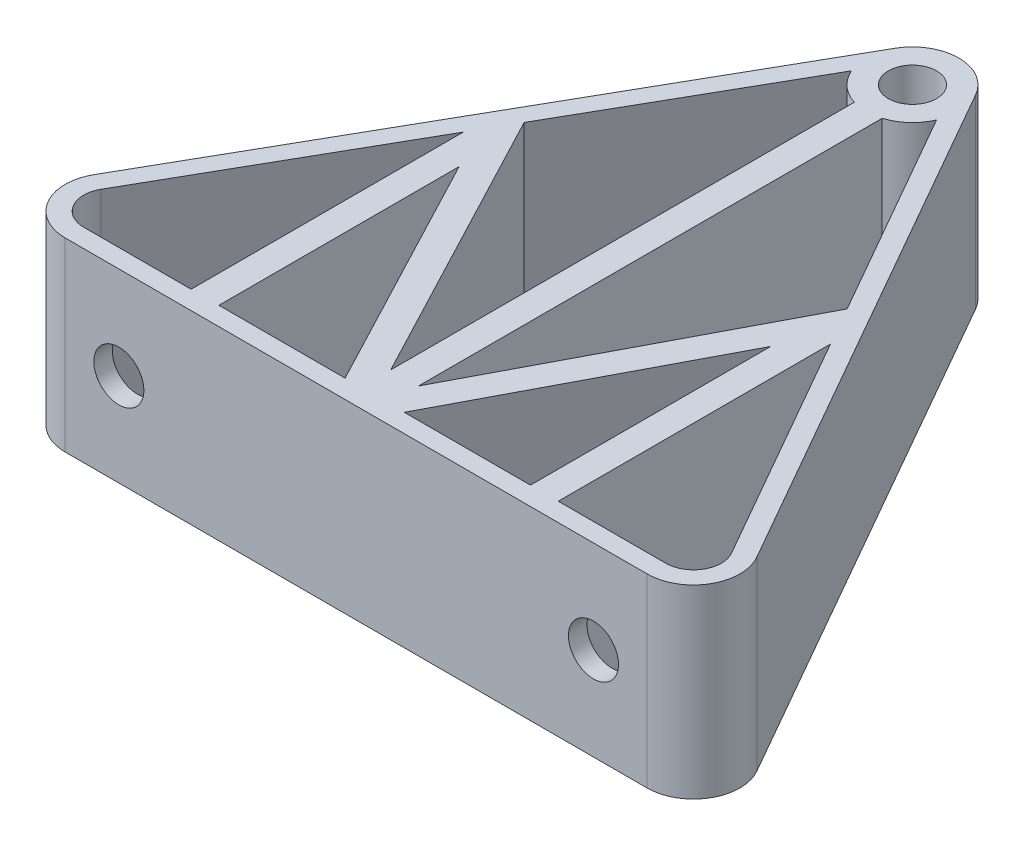
ISO-10303-21;
HEADER;
FILE_DESCRIPTION(('STEP AP214'),'2;1');
FILE_NAME('part.step','',(''),(''),'','','');
FILE_SCHEMA(('AUTOMOTIVE_DESIGN { 1 0 10303 214 1 1 1 1 }'));
ENDSEC;
DATA;
#1=APPLICATION_CONTEXT('core data for automotive mechanical design processes');
#2=APPLICATION_PROTOCOL_DEFINITION('international standard','automotive_design',2000,#1);
#3=PRODUCT_CONTEXT('',#1,'mechanical');
#4=PRODUCT('Part','Part','',(#3));
#5=PRODUCT_RELATED_PRODUCT_CATEGORY('part','',(#4));
#6=PRODUCT_DEFINITION_FORMATION('','',#4);
#7=PRODUCT_DEFINITION_CONTEXT('part definition',#1,'design');
#8=PRODUCT_DEFINITION('design','',#6,#7);
#9=PRODUCT_DEFINITION_SHAPE('','',#8);
#10=(LENGTH_UNIT() NAMED_UNIT(*) SI_UNIT(.MILLI.,.METRE.));
#11=(NAMED_UNIT(*) PLANE_ANGLE_UNIT() SI_UNIT($,.RADIAN.));
#12=(NAMED_UNIT(*) SI_UNIT($,.STERADIAN.) SOLID_ANGLE_UNIT());
#13=UNCERTAINTY_MEASURE_WITH_UNIT(LENGTH_MEASURE(1.E-05),#10,'distance_accuracy_value','');
#14=(GEOMETRIC_REPRESENTATION_CONTEXT(3) GLOBAL_UNCERTAINTY_ASSIGNED_CONTEXT((#13)) GLOBAL_UNIT_ASSIGNED_CONTEXT((#10,
#11,#12)) REPRESENTATION_CONTEXT('',''));
#15=CARTESIAN_POINT('',(0.,0.,0.));
#16=DIRECTION('',(0.,0.,1.));
#17=DIRECTION('',(1.,0.,0.));
#18=AXIS2_PLACEMENT_3D('',#15,#16,#17);
#19=CARTESIAN_POINT('',(0.,20.,0.));
#20=DIRECTION('',(0.,1.,0.));
#21=DIRECTION('',(0.,0.,1.));
#22=AXIS2_PLACEMENT_3D('',#19,#20,#21);
#23=PLANE('',#22);
#24=CARTESIAN_POINT('',(0.,20.,0.));
#25=DIRECTION('',(0.,1.,0.));
#26=DIRECTION('',(0.,0.,1.));
#27=AXIS2_PLACEMENT_3D('',#24,#25,#26);
#28=CIRCLE('',#27,2.6);
#29=CARTESIAN_POINT('',(0.,20.,2.6));
#30=VERTEX_POINT('',#29);
#31=EDGE_CURVE('E282',#30,#30,#28,.T.);
#32=ORIENTED_EDGE('',*,*,#31,.F.);
#33=EDGE_LOOP('',(#32));
#34=FACE_BOUND('',#33,.T.);
#35=DIRECTION('',(1.,0.,0.));
#36=VECTOR('',#35,1.);
#37=CARTESIAN_POINT('',(0.,20.,58.));
#38=LINE('',#37,#36);
#39=CARTESIAN_POINT('',(3.19430737518054,20.,58.));
#40=VERTEX_POINT('',#39);
#41=CARTESIAN_POINT('',(16.8002404890396,20.,58.));
#42=VERTEX_POINT('',#41);
#43=EDGE_CURVE('E91',#40,#42,#38,.T.);
#44=ORIENTED_EDGE('',*,*,#43,.F.);
#45=DIRECTION('',(-0.464986980948784,0.,0.885317517926837));
#46=VECTOR('',#45,1.);
#47=CARTESIAN_POINT('',(26.3800018890409,20.,13.8553199133941));
#48=LINE('',#47,#46);
#49=CARTESIAN_POINT('',(16.8002404890396,20.,32.0948210875456));
#50=VERTEX_POINT('',#49);
#51=EDGE_CURVE('E276',#50,#40,#48,.T.);
#52=ORIENTED_EDGE('',*,*,#51,.F.);
#53=DIRECTION('',(0.,0.,-1.));
#54=VECTOR('',#53,1.);
#55=CARTESIAN_POINT('',(16.8002404890396,20.,0.));
#56=LINE('',#55,#54);
#57=EDGE_CURVE('E279',#42,#50,#56,.T.);
#58=ORIENTED_EDGE('',*,*,#57,.F.);
#59=EDGE_LOOP('',(#44,#52,#58));
#60=FACE_BOUND('',#59,.T.);
#61=DIRECTION('',(1.,0.,0.));
#62=VECTOR('',#61,1.);
#63=CARTESIAN_POINT('',(0.,20.,58.));
#64=LINE('',#63,#62);
#65=CARTESIAN_POINT('',(19.8002404890396,20.,58.));
#66=VERTEX_POINT('',#65);
#67=CARTESIAN_POINT('',(31.3894251654084,20.,58.));
#68=VERTEX_POINT('',#67);
#69=EDGE_CURVE('E291',#66,#68,#64,.T.);
#70=ORIENTED_EDGE('',*,*,#69,.F.);
#71=DIRECTION('',(0.,0.,-1.));
#72=VECTOR('',#71,1.);
#73=CARTESIAN_POINT('',(19.8002404890396,20.,0.));
#74=LINE('',#73,#72);
#75=CARTESIAN_POINT('',(19.8002404890396,20.,28.6412550760129));
#76=VERTEX_POINT('',#75);
#77=EDGE_CURVE('E297',#66,#76,#74,.T.);
#78=ORIENTED_EDGE('',*,*,#77,.T.);
#79=DIRECTION('',(-0.495672868074545,0.,-0.868509302111817));
#80=VECTOR('',#79,1.);
#81=CARTESIAN_POINT('',(2.60552790633545,20.,-1.48701860422363));
#82=LINE('',#81,#80);
#83=CARTESIAN_POINT('',(33.9949530717438,20.,53.5129813957763));
#84=VERTEX_POINT('',#83);
#85=EDGE_CURVE('E310',#84,#76,#82,.T.);
#86=ORIENTED_EDGE('',*,*,#85,.F.);
#87=CARTESIAN_POINT('',(31.3894251654084,20.,55.));
#88=DIRECTION('',(0.,1.,0.));
#89=DIRECTION('',(0.,0.,1.));
#90=AXIS2_PLACEMENT_3D('',#87,#88,#89);
#91=CIRCLE('',#90,3.);
#92=EDGE_CURVE('E307',#68,#84,#91,.T.);
#93=ORIENTED_EDGE('',*,*,#92,.F.);
#94=EDGE_LOOP('',(#70,#78,#86,#93));
#95=FACE_BOUND('',#94,.T.);
#96=DIRECTION('',(-0.495672868074545,0.,0.868509302111817));
#97=VECTOR('',#96,1.);
#98=CARTESIAN_POINT('',(-2.60552790633545,20.,-1.48701860422363));
#99=LINE('',#98,#97);
#100=CARTESIAN_POINT('',(-4.58821937863363,20.,1.98701860422363));
#101=VERTEX_POINT('',#100);
#102=CARTESIAN_POINT('',(-17.4179184535525,20.,24.4669922068672));
#103=VERTEX_POINT('',#102);
#104=EDGE_CURVE('E370',#101,#103,#99,.T.);
#105=ORIENTED_EDGE('',*,*,#104,.F.);
#106=CARTESIAN_POINT('',(0.,20.,0.));
#107=DIRECTION('',(0.,1.,0.));
#108=DIRECTION('',(0.,0.,1.));
#109=AXIS2_PLACEMENT_3D('',#106,#107,#108);
#110=CIRCLE('',#109,5.);
#111=CARTESIAN_POINT('',(-1.50000000000001,20.,4.76969600708473));
#112=VERTEX_POINT('',#111);
#113=EDGE_CURVE('E349',#101,#112,#110,.T.);
#114=ORIENTED_EDGE('',*,*,#113,.T.);
#115=DIRECTION('',(0.,0.,1.));
#116=VECTOR('',#115,1.);
#117=CARTESIAN_POINT('',(-1.50000000000001,20.,0.));
#118=LINE('',#117,#116);
#119=CARTESIAN_POINT('',(-1.50000000000002,20.,54.7741032298596));
#120=VERTEX_POINT('',#119);
#121=EDGE_CURVE('E359',#112,#120,#118,.T.);
#122=ORIENTED_EDGE('',*,*,#121,.T.);
#123=DIRECTION('',(0.464986980948784,0.,0.885317517926837));
#124=VECTOR('',#123,1.);
#125=CARTESIAN_POINT('',(-23.7240493352604,20.,12.4603589705478));
#126=LINE('',#125,#124);
#127=EDGE_CURVE('E373',#103,#120,#126,.T.);
#128=ORIENTED_EDGE('',*,*,#127,.F.);
#129=EDGE_LOOP('',(#105,#114,#122,#128));
#130=FACE_BOUND('',#129,.T.);
#131=DIRECTION('',(-0.495672868074545,0.,-0.868509302111817));
#132=VECTOR('',#131,1.);
#133=CARTESIAN_POINT('',(4.34254651055908,20.,-2.47836434037272));
#134=LINE('',#133,#132);
#135=CARTESIAN_POINT('',(35.7319716759675,20.,52.5216356596272));
#136=VERTEX_POINT('',#135);
#137=CARTESIAN_POINT('',(4.34254651055908,20.,-2.47836434037272));
#138=VERTEX_POINT('',#137);
#139=EDGE_CURVE('E443',#136,#138,#134,.T.);
#140=ORIENTED_EDGE('',*,*,#139,.T.);
#141=CARTESIAN_POINT('',(0.,20.,0.));
#142=DIRECTION('',(0.,1.,0.));
#143=DIRECTION('',(0.,0.,1.));
#144=AXIS2_PLACEMENT_3D('',#141,#142,#143);
#145=CIRCLE('',#144,5.);
#146=CARTESIAN_POINT('',(-4.34254651055909,20.,-2.47836434037272));
#147=VERTEX_POINT('',#146);
#148=EDGE_CURVE('E446',#138,#147,#145,.T.);
#149=ORIENTED_EDGE('',*,*,#148,.T.);
#150=DIRECTION('',(0.495672868074544,0.,-0.868509302111817));
#151=VECTOR('',#150,1.);
#152=CARTESIAN_POINT('',(-4.34254651055909,20.,-2.47836434037272));
#153=LINE('',#152,#151);
#154=CARTESIAN_POINT('',(-35.7319716759675,20.,52.5216356596272));
#155=VERTEX_POINT('',#154);
#156=EDGE_CURVE('E449',#155,#147,#153,.T.);
#157=ORIENTED_EDGE('',*,*,#156,.F.);
#158=CARTESIAN_POINT('',(-31.3894251654084,20.,55.));
#159=DIRECTION('',(0.,1.,0.));
#160=DIRECTION('',(0.,0.,1.));
#161=AXIS2_PLACEMENT_3D('',#158,#159,#160);
#162=CIRCLE('',#161,5.);
#163=CARTESIAN_POINT('',(-31.3894251654083,20.,60.));
#164=VERTEX_POINT('',#163);
#165=EDGE_CURVE('E452',#155,#164,#162,.T.);
#166=ORIENTED_EDGE('',*,*,#165,.T.);
#167=DIRECTION('',(-1.,0.,0.));
#168=VECTOR('',#167,1.);
#169=CARTESIAN_POINT('',(0.,20.,60.));
#170=LINE('',#169,#168);
#171=CARTESIAN_POINT('',(31.3894251654083,20.,60.));
#172=VERTEX_POINT('',#171);
#173=EDGE_CURVE('E454',#172,#164,#170,.T.);
#174=ORIENTED_EDGE('',*,*,#173,.F.);
#175=CARTESIAN_POINT('',(31.3894251654084,20.,55.));
#176=DIRECTION('',(0.,1.,0.));
#177=DIRECTION('',(0.,0.,1.));
#178=AXIS2_PLACEMENT_3D('',#175,#176,#177);
#179=CIRCLE('',#178,5.);
#180=EDGE_CURVE('E457',#136,#172,#179,.F.);
#181=ORIENTED_EDGE('',*,*,#180,.F.);
#182=EDGE_LOOP('',(#140,#149,#157,#166,#174,#181));
#183=FACE_BOUND('',#182,.T.);
#184=DIRECTION('',(-0.495672868074545,0.,0.868509302111817));
#185=VECTOR('',#184,1.);
#186=CARTESIAN_POINT('',(-2.60552790633545,20.,-1.48701860422363));
#187=LINE('',#186,#185);
#188=CARTESIAN_POINT('',(-19.8002404890396,20.,28.641255076013));
#189=VERTEX_POINT('',#188);
#190=CARTESIAN_POINT('',(-33.9949530717438,20.,53.5129813957763));
#191=VERTEX_POINT('',#190);
#192=EDGE_CURVE('E406',#189,#191,#187,.T.);
#193=ORIENTED_EDGE('',*,*,#192,.F.);
#194=DIRECTION('',(0.,0.,-1.));
#195=VECTOR('',#194,1.);
#196=CARTESIAN_POINT('',(-19.8002404890396,20.,0.));
#197=LINE('',#196,#195);
#198=CARTESIAN_POINT('',(-19.8002404890396,20.,58.));
#199=VERTEX_POINT('',#198);
#200=EDGE_CURVE('E415',#199,#189,#197,.T.);
#201=ORIENTED_EDGE('',*,*,#200,.F.);
#202=DIRECTION('',(1.,0.,0.));
#203=VECTOR('',#202,1.);
#204=CARTESIAN_POINT('',(0.,20.,58.));
#205=LINE('',#204,#203);
#206=CARTESIAN_POINT('',(-31.3894251654084,20.,58.));
#207=VERTEX_POINT('',#206);
#208=EDGE_CURVE('E429',#207,#199,#205,.T.);
#209=ORIENTED_EDGE('',*,*,#208,.F.);
#210=CARTESIAN_POINT('',(-31.3894251654084,20.,55.));
#211=DIRECTION('',(0.,1.,0.));
#212=DIRECTION('',(0.,0.,1.));
#213=AXIS2_PLACEMENT_3D('',#210,#211,#212);
#214=CIRCLE('',#213,3.00000000000001);
#215=EDGE_CURVE('E426',#191,#207,#214,.T.);
#216=ORIENTED_EDGE('',*,*,#215,.F.);
#217=EDGE_LOOP('',(#193,#201,#209,#216));
#218=FACE_BOUND('',#217,.T.);
#219=DIRECTION('',(0.,0.,-1.));
#220=VECTOR('',#219,1.);
#221=CARTESIAN_POINT('',(-16.8002404890396,20.,0.));
#222=LINE('',#221,#220);
#223=CARTESIAN_POINT('',(-16.8002404890396,20.,58.));
#224=VERTEX_POINT('',#223);
#225=CARTESIAN_POINT('',(-16.8002404890396,20.,32.0948210875456));
#226=VERTEX_POINT('',#225);
#227=EDGE_CURVE('E399',#224,#226,#222,.T.);
#228=ORIENTED_EDGE('',*,*,#227,.T.);
#229=DIRECTION('',(0.464986980948784,0.,0.885317517926837));
#230=VECTOR('',#229,1.);
#231=CARTESIAN_POINT('',(-26.3800018890409,20.,13.8553199133941));
#232=LINE('',#231,#230);
#233=CARTESIAN_POINT('',(-3.19430737518055,20.,58.));
#234=VERTEX_POINT('',#233);
#235=EDGE_CURVE('E381',#226,#234,#232,.T.);
#236=ORIENTED_EDGE('',*,*,#235,.T.);
#237=DIRECTION('',(1.,0.,0.));
#238=VECTOR('',#237,1.);
#239=CARTESIAN_POINT('',(0.,20.,58.));
#240=LINE('',#239,#238);
#241=EDGE_CURVE('E391',#224,#234,#240,.T.);
#242=ORIENTED_EDGE('',*,*,#241,.F.);
#243=EDGE_LOOP('',(#228,#236,#242));
#244=FACE_BOUND('',#243,.T.);
#245=DIRECTION('',(0.,0.,1.));
#246=VECTOR('',#245,1.);
#247=CARTESIAN_POINT('',(1.5,20.,0.));
#248=LINE('',#247,#246);
#249=CARTESIAN_POINT('',(1.5,20.,4.76969600708473));
#250=VERTEX_POINT('',#249);
#251=CARTESIAN_POINT('',(1.50000000000001,20.,54.7741032298596));
#252=VERTEX_POINT('',#251);
#253=EDGE_CURVE('E339',#250,#252,#248,.T.);
#254=ORIENTED_EDGE('',*,*,#253,.F.);
#255=CARTESIAN_POINT('',(0.,20.,0.));
#256=DIRECTION('',(0.,1.,0.));
#257=DIRECTION('',(0.,0.,1.));
#258=AXIS2_PLACEMENT_3D('',#255,#256,#257);
#259=CIRCLE('',#258,5.);
#260=CARTESIAN_POINT('',(4.58821937863363,20.,1.98701860422364));
#261=VERTEX_POINT('',#260);
#262=EDGE_CURVE('E317',#250,#261,#259,.T.);
#263=ORIENTED_EDGE('',*,*,#262,.T.);
#264=DIRECTION('',(-0.495672868074545,0.,-0.868509302111817));
#265=VECTOR('',#264,1.);
#266=CARTESIAN_POINT('',(2.60552790633545,20.,-1.48701860422363));
#267=LINE('',#266,#265);
#268=CARTESIAN_POINT('',(17.4179184535524,20.,24.4669922068672));
#269=VERTEX_POINT('',#268);
#270=EDGE_CURVE('E327',#269,#261,#267,.T.);
#271=ORIENTED_EDGE('',*,*,#270,.F.);
#272=DIRECTION('',(-0.464986980948784,0.,0.885317517926837));
#273=VECTOR('',#272,1.);
#274=CARTESIAN_POINT('',(23.7240493352604,20.,12.4603589705478));
#275=LINE('',#274,#273);
#276=EDGE_CURVE('E342',#269,#252,#275,.T.);
#277=ORIENTED_EDGE('',*,*,#276,.T.);
#278=EDGE_LOOP('',(#254,#263,#271,#277));
#279=FACE_BOUND('',#278,.T.);
#280=ADVANCED_FACE('F76',(#34,#60,#95,#130,#183,#218,#244,#279),#23,.T.);
#281=CARTESIAN_POINT('',(0.,0.,0.));
#282=DIRECTION('',(0.,1.,0.));
#283=DIRECTION('',(0.,0.,1.));
#284=AXIS2_PLACEMENT_3D('',#281,#282,#283);
#285=PLANE('',#284);
#286=CARTESIAN_POINT('',(0.,0.,0.));
#287=DIRECTION('',(0.,1.,0.));
#288=DIRECTION('',(0.,0.,1.));
#289=AXIS2_PLACEMENT_3D('',#286,#287,#288);
#290=CIRCLE('',#289,2.6);
#291=CARTESIAN_POINT('',(0.,0.,2.6));
#292=VERTEX_POINT('',#291);
#293=EDGE_CURVE('E287',#292,#292,#290,.T.);
#294=ORIENTED_EDGE('',*,*,#293,.T.);
#295=EDGE_LOOP('',(#294));
#296=FACE_BOUND('',#295,.T.);
#297=DIRECTION('',(-0.464986980948784,0.,0.885317517926837));
#298=VECTOR('',#297,1.);
#299=CARTESIAN_POINT('',(26.3800018890409,0.,13.8553199133941));
#300=LINE('',#299,#298);
#301=CARTESIAN_POINT('',(16.8002404890396,0.,32.0948210875456));
#302=VERTEX_POINT('',#301);
#303=CARTESIAN_POINT('',(3.19430737518054,0.,58.));
#304=VERTEX_POINT('',#303);
#305=EDGE_CURVE('E99',#302,#304,#300,.T.);
#306=ORIENTED_EDGE('',*,*,#305,.T.);
#307=DIRECTION('',(1.,0.,0.));
#308=VECTOR('',#307,1.);
#309=CARTESIAN_POINT('',(0.,0.,58.));
#310=LINE('',#309,#308);
#311=CARTESIAN_POINT('',(16.8002404890396,0.,58.));
#312=VERTEX_POINT('',#311);
#313=EDGE_CURVE('E263',#304,#312,#310,.T.);
#314=ORIENTED_EDGE('',*,*,#313,.T.);
#315=DIRECTION('',(0.,0.,-1.));
#316=VECTOR('',#315,1.);
#317=CARTESIAN_POINT('',(16.8002404890396,0.,0.));
#318=LINE('',#317,#316);
#319=EDGE_CURVE('E270',#312,#302,#318,.T.);
#320=ORIENTED_EDGE('',*,*,#319,.T.);
#321=EDGE_LOOP('',(#306,#314,#320));
#322=FACE_BOUND('',#321,.T.);
#323=DIRECTION('',(0.,0.,-1.));
#324=VECTOR('',#323,1.);
#325=CARTESIAN_POINT('',(19.8002404890396,0.,0.));
#326=LINE('',#325,#324);
#327=CARTESIAN_POINT('',(19.8002404890396,0.,58.));
#328=VERTEX_POINT('',#327);
#329=CARTESIAN_POINT('',(19.8002404890396,0.,28.6412550760129));
#330=VERTEX_POINT('',#329);
#331=EDGE_CURVE('E303',#328,#330,#326,.T.);
#332=ORIENTED_EDGE('',*,*,#331,.F.);
#333=DIRECTION('',(1.,0.,0.));
#334=VECTOR('',#333,1.);
#335=CARTESIAN_POINT('',(0.,0.,58.));
#336=LINE('',#335,#334);
#337=CARTESIAN_POINT('',(31.3894251654083,0.,58.));
#338=VERTEX_POINT('',#337);
#339=EDGE_CURVE('E293',#328,#338,#336,.T.);
#340=ORIENTED_EDGE('',*,*,#339,.T.);
#341=CARTESIAN_POINT('',(31.3894251654084,0.,55.));
#342=DIRECTION('',(0.,1.,0.));
#343=DIRECTION('',(0.,0.,1.));
#344=AXIS2_PLACEMENT_3D('',#341,#342,#343);
#345=CIRCLE('',#344,3.);
#346=CARTESIAN_POINT('',(33.9949530717438,0.,53.5129813957763));
#347=VERTEX_POINT('',#346);
#348=EDGE_CURVE('E296',#338,#347,#345,.T.);
#349=ORIENTED_EDGE('',*,*,#348,.T.);
#350=DIRECTION('',(-0.495672868074545,0.,-0.868509302111817));
#351=VECTOR('',#350,1.);
#352=CARTESIAN_POINT('',(2.60552790633545,0.,-1.48701860422363));
#353=LINE('',#352,#351);
#354=EDGE_CURVE('E300',#347,#330,#353,.T.);
#355=ORIENTED_EDGE('',*,*,#354,.T.);
#356=EDGE_LOOP('',(#332,#340,#349,#355));
#357=FACE_BOUND('',#356,.T.);
#358=CARTESIAN_POINT('',(0.,0.,0.));
#359=DIRECTION('',(0.,1.,0.));
#360=DIRECTION('',(0.,0.,1.));
#361=AXIS2_PLACEMENT_3D('',#358,#359,#360);
#362=CIRCLE('',#361,5.);
#363=CARTESIAN_POINT('',(-4.58821937863363,0.,1.98701860422363));
#364=VERTEX_POINT('',#363);
#365=CARTESIAN_POINT('',(-1.50000000000001,0.,4.76969600708473));
#366=VERTEX_POINT('',#365);
#367=EDGE_CURVE('E356',#364,#366,#362,.T.);
#368=ORIENTED_EDGE('',*,*,#367,.F.);
#369=DIRECTION('',(-0.495672868074545,0.,0.868509302111817));
#370=VECTOR('',#369,1.);
#371=CARTESIAN_POINT('',(-2.60552790633545,0.,-1.48701860422363));
#372=LINE('',#371,#370);
#373=CARTESIAN_POINT('',(-17.4179184535525,0.,24.4669922068672));
#374=VERTEX_POINT('',#373);
#375=EDGE_CURVE('E358',#364,#374,#372,.T.);
#376=ORIENTED_EDGE('',*,*,#375,.T.);
#377=DIRECTION('',(0.464986980948784,0.,0.885317517926837));
#378=VECTOR('',#377,1.);
#379=CARTESIAN_POINT('',(-23.7240493352604,0.,12.4603589705478));
#380=LINE('',#379,#378);
#381=CARTESIAN_POINT('',(-1.50000000000002,0.,54.7741032298596));
#382=VERTEX_POINT('',#381);
#383=EDGE_CURVE('E362',#374,#382,#380,.T.);
#384=ORIENTED_EDGE('',*,*,#383,.T.);
#385=DIRECTION('',(0.,0.,1.));
#386=VECTOR('',#385,1.);
#387=CARTESIAN_POINT('',(-1.50000000000001,0.,0.));
#388=LINE('',#387,#386);
#389=EDGE_CURVE('E365',#366,#382,#388,.T.);
#390=ORIENTED_EDGE('',*,*,#389,.F.);
#391=EDGE_LOOP('',(#368,#376,#384,#390));
#392=FACE_BOUND('',#391,.T.);
#393=DIRECTION('',(-0.495672868074545,0.,-0.868509302111817));
#394=VECTOR('',#393,1.);
#395=CARTESIAN_POINT('',(4.34254651055908,0.,-2.47836434037272));
#396=LINE('',#395,#394);
#397=CARTESIAN_POINT('',(35.7319716759675,0.,52.5216356596272));
#398=VERTEX_POINT('',#397);
#399=CARTESIAN_POINT('',(4.34254651055908,0.,-2.47836434037272));
#400=VERTEX_POINT('',#399);
#401=EDGE_CURVE('E436',#398,#400,#396,.T.);
#402=ORIENTED_EDGE('',*,*,#401,.F.);
#403=CARTESIAN_POINT('',(31.3894251654084,0.,55.));
#404=DIRECTION('',(0.,1.,0.));
#405=DIRECTION('',(0.,0.,1.));
#406=AXIS2_PLACEMENT_3D('',#403,#404,#405);
#407=CIRCLE('',#406,5.);
#408=CARTESIAN_POINT('',(31.3894251654083,0.,60.));
#409=VERTEX_POINT('',#408);
#410=EDGE_CURVE('E447',#398,#409,#407,.F.);
#411=ORIENTED_EDGE('',*,*,#410,.T.);
#412=DIRECTION('',(-1.,0.,0.));
#413=VECTOR('',#412,1.);
#414=CARTESIAN_POINT('',(0.,0.,60.));
#415=LINE('',#414,#413);
#416=CARTESIAN_POINT('',(-31.3894251654083,0.,60.));
#417=VERTEX_POINT('',#416);
#418=EDGE_CURVE('E472',#409,#417,#415,.T.);
#419=ORIENTED_EDGE('',*,*,#418,.T.);
#420=CARTESIAN_POINT('',(-31.3894251654084,0.,55.));
#421=DIRECTION('',(0.,1.,0.));
#422=DIRECTION('',(0.,0.,1.));
#423=AXIS2_PLACEMENT_3D('',#420,#421,#422);
#424=CIRCLE('',#423,5.);
#425=CARTESIAN_POINT('',(-35.7319716759675,0.,52.5216356596272));
#426=VERTEX_POINT('',#425);
#427=EDGE_CURVE('E469',#426,#417,#424,.T.);
#428=ORIENTED_EDGE('',*,*,#427,.F.);
#429=DIRECTION('',(0.495672868074544,0.,-0.868509302111817));
#430=VECTOR('',#429,1.);
#431=CARTESIAN_POINT('',(-4.34254651055909,0.,-2.47836434037272));
#432=LINE('',#431,#430);
#433=CARTESIAN_POINT('',(-4.34254651055909,0.,-2.47836434037272));
#434=VERTEX_POINT('',#433);
#435=EDGE_CURVE('E466',#426,#434,#432,.T.);
#436=ORIENTED_EDGE('',*,*,#435,.T.);
#437=CARTESIAN_POINT('',(0.,0.,0.));
#438=DIRECTION('',(0.,1.,0.));
#439=DIRECTION('',(0.,0.,1.));
#440=AXIS2_PLACEMENT_3D('',#437,#438,#439);
#441=CIRCLE('',#440,5.);
#442=EDGE_CURVE('E463',#400,#434,#441,.T.);
#443=ORIENTED_EDGE('',*,*,#442,.F.);
#444=EDGE_LOOP('',(#402,#411,#419,#428,#436,#443));
#445=FACE_BOUND('',#444,.T.);
#446=DIRECTION('',(0.,0.,-1.));
#447=VECTOR('',#446,1.);
#448=CARTESIAN_POINT('',(-19.8002404890396,0.,0.));
#449=LINE('',#448,#447);
#450=CARTESIAN_POINT('',(-19.8002404890396,0.,58.));
#451=VERTEX_POINT('',#450);
#452=CARTESIAN_POINT('',(-19.8002404890396,0.,28.641255076013));
#453=VERTEX_POINT('',#452);
#454=EDGE_CURVE('E421',#451,#453,#449,.T.);
#455=ORIENTED_EDGE('',*,*,#454,.T.);
#456=DIRECTION('',(-0.495672868074545,0.,0.868509302111817));
#457=VECTOR('',#456,1.);
#458=CARTESIAN_POINT('',(-2.60552790633545,0.,-1.48701860422363));
#459=LINE('',#458,#457);
#460=CARTESIAN_POINT('',(-33.9949530717438,0.,53.5129813957763));
#461=VERTEX_POINT('',#460);
#462=EDGE_CURVE('E411',#453,#461,#459,.T.);
#463=ORIENTED_EDGE('',*,*,#462,.T.);
#464=CARTESIAN_POINT('',(-31.3894251654084,0.,55.));
#465=DIRECTION('',(0.,1.,0.));
#466=DIRECTION('',(0.,0.,1.));
#467=AXIS2_PLACEMENT_3D('',#464,#465,#466);
#468=CIRCLE('',#467,3.00000000000001);
#469=CARTESIAN_POINT('',(-31.3894251654084,0.,58.));
#470=VERTEX_POINT('',#469);
#471=EDGE_CURVE('E414',#461,#470,#468,.T.);
#472=ORIENTED_EDGE('',*,*,#471,.T.);
#473=DIRECTION('',(1.,0.,0.));
#474=VECTOR('',#473,1.);
#475=CARTESIAN_POINT('',(0.,0.,58.));
#476=LINE('',#475,#474);
#477=EDGE_CURVE('E418',#470,#451,#476,.T.);
#478=ORIENTED_EDGE('',*,*,#477,.T.);
#479=EDGE_LOOP('',(#455,#463,#472,#478));
#480=FACE_BOUND('',#479,.T.);
#481=DIRECTION('',(0.464986980948784,0.,0.885317517926837));
#482=VECTOR('',#481,1.);
#483=CARTESIAN_POINT('',(-26.3800018890409,0.,13.8553199133941));
#484=LINE('',#483,#482);
#485=CARTESIAN_POINT('',(-16.8002404890396,0.,32.0948210875456));
#486=VERTEX_POINT('',#485);
#487=CARTESIAN_POINT('',(-3.19430737518055,0.,58.));
#488=VERTEX_POINT('',#487);
#489=EDGE_CURVE('E388',#486,#488,#484,.T.);
#490=ORIENTED_EDGE('',*,*,#489,.F.);
#491=DIRECTION('',(0.,0.,-1.));
#492=VECTOR('',#491,1.);
#493=CARTESIAN_POINT('',(-16.8002404890396,0.,0.));
#494=LINE('',#493,#492);
#495=CARTESIAN_POINT('',(-16.8002404890396,0.,58.));
#496=VERTEX_POINT('',#495);
#497=EDGE_CURVE('E390',#496,#486,#494,.T.);
#498=ORIENTED_EDGE('',*,*,#497,.F.);
#499=DIRECTION('',(1.,0.,0.));
#500=VECTOR('',#499,1.);
#501=CARTESIAN_POINT('',(0.,0.,58.));
#502=LINE('',#501,#500);
#503=EDGE_CURVE('E393',#496,#488,#502,.T.);
#504=ORIENTED_EDGE('',*,*,#503,.T.);
#505=EDGE_LOOP('',(#490,#498,#504));
#506=FACE_BOUND('',#505,.T.);
#507=CARTESIAN_POINT('',(0.,0.,0.));
#508=DIRECTION('',(0.,1.,0.));
#509=DIRECTION('',(0.,0.,1.));
#510=AXIS2_PLACEMENT_3D('',#507,#508,#509);
#511=CIRCLE('',#510,5.);
#512=CARTESIAN_POINT('',(1.5,0.,4.76969600708473));
#513=VERTEX_POINT('',#512);
#514=CARTESIAN_POINT('',(4.58821937863363,0.,1.98701860422364));
#515=VERTEX_POINT('',#514);
#516=EDGE_CURVE('E324',#513,#515,#511,.T.);
#517=ORIENTED_EDGE('',*,*,#516,.F.);
#518=DIRECTION('',(0.,0.,1.));
#519=VECTOR('',#518,1.);
#520=CARTESIAN_POINT('',(1.5,0.,0.));
#521=LINE('',#520,#519);
#522=CARTESIAN_POINT('',(1.50000000000001,0.,54.7741032298596));
#523=VERTEX_POINT('',#522);
#524=EDGE_CURVE('E326',#513,#523,#521,.T.);
#525=ORIENTED_EDGE('',*,*,#524,.T.);
#526=DIRECTION('',(-0.464986980948784,0.,0.885317517926837));
#527=VECTOR('',#526,1.);
#528=CARTESIAN_POINT('',(23.7240493352604,0.,12.4603589705478));
#529=LINE('',#528,#527);
#530=CARTESIAN_POINT('',(17.4179184535524,0.,24.4669922068672));
#531=VERTEX_POINT('',#530);
#532=EDGE_CURVE('E330',#531,#523,#529,.T.);
#533=ORIENTED_EDGE('',*,*,#532,.F.);
#534=DIRECTION('',(-0.495672868074545,0.,-0.868509302111817));
#535=VECTOR('',#534,1.);
#536=CARTESIAN_POINT('',(2.60552790633545,0.,-1.48701860422363));
#537=LINE('',#536,#535);
#538=EDGE_CURVE('E333',#531,#515,#537,.T.);
#539=ORIENTED_EDGE('',*,*,#538,.T.);
#540=EDGE_LOOP('',(#517,#525,#533,#539));
#541=FACE_BOUND('',#540,.T.);
#542=ADVANCED_FACE('F274',(#296,#322,#357,#392,#445,#480,#506,#541),#285,.F.);
#543=CARTESIAN_POINT('',(4.34254651055908,20.,-2.47836434037272));
#544=DIRECTION('',(-0.868509302111817,0.,0.495672868074545));
#545=DIRECTION('',(0.495672868074545,0.,0.868509302111817));
#546=AXIS2_PLACEMENT_3D('',#543,#544,#545);
#547=PLANE('',#546);
#548=ORIENTED_EDGE('',*,*,#401,.T.);
#549=DIRECTION('',(0.,-1.,0.));
#550=VECTOR('',#549,1.);
#551=CARTESIAN_POINT('',(4.34254651055908,20.,-2.47836434037272));
#552=LINE('',#551,#550);
#553=EDGE_CURVE('E12',#138,#400,#552,.T.);
#554=ORIENTED_EDGE('',*,*,#553,.F.);
#555=ORIENTED_EDGE('',*,*,#139,.F.);
#556=DIRECTION('',(0.,-1.,0.));
#557=VECTOR('',#556,1.);
#558=CARTESIAN_POINT('',(35.7319716759675,20.,52.5216356596272));
#559=LINE('',#558,#557);
#560=EDGE_CURVE('E460',#136,#398,#559,.T.);
#561=ORIENTED_EDGE('',*,*,#560,.T.);
#562=EDGE_LOOP('',(#548,#554,#555,#561));
#563=FACE_BOUND('',#562,.T.);
#564=ADVANCED_FACE('F78',(#563),#547,.F.);
#565=CARTESIAN_POINT('',(0.,20.,0.));
#566=DIRECTION('',(0.,-1.,0.));
#567=DIRECTION('',(0.,0.,-1.));
#568=AXIS2_PLACEMENT_3D('',#565,#566,#567);
#569=CYLINDRICAL_SURFACE('',#568,5.);
#570=ORIENTED_EDGE('',*,*,#442,.T.);
#571=DIRECTION('',(0.,-1.,0.));
#572=VECTOR('',#571,1.);
#573=CARTESIAN_POINT('',(-4.34254651055909,20.,-2.47836434037272));
#574=LINE('',#573,#572);
#575=EDGE_CURVE('E84',#147,#434,#574,.T.);
#576=ORIENTED_EDGE('',*,*,#575,.F.);
#577=ORIENTED_EDGE('',*,*,#148,.F.);
#578=ORIENTED_EDGE('',*,*,#553,.T.);
#579=EDGE_LOOP('',(#570,#576,#577,#578));
#580=FACE_BOUND('',#579,.T.);
#581=ADVANCED_FACE('F489',(#580),#569,.T.);
#582=CARTESIAN_POINT('',(-4.34254651055909,20.,-2.47836434037272));
#583=DIRECTION('',(-0.868509302111817,0.,-0.495672868074544));
#584=DIRECTION('',(-0.495672868074544,0.,0.868509302111817));
#585=AXIS2_PLACEMENT_3D('',#582,#583,#584);
#586=PLANE('',#585);
#587=ORIENTED_EDGE('',*,*,#435,.F.);
#588=DIRECTION('',(0.,-1.,0.));
#589=VECTOR('',#588,1.);
#590=CARTESIAN_POINT('',(-35.7319716759675,20.,52.5216356596272));
#591=LINE('',#590,#589);
#592=EDGE_CURVE('E482',#155,#426,#591,.T.);
#593=ORIENTED_EDGE('',*,*,#592,.F.);
#594=ORIENTED_EDGE('',*,*,#156,.T.);
#595=ORIENTED_EDGE('',*,*,#575,.T.);
#596=EDGE_LOOP('',(#587,#593,#594,#595));
#597=FACE_BOUND('',#596,.T.);
#598=ADVANCED_FACE('F486',(#597),#586,.T.);
#599=CARTESIAN_POINT('',(-31.3894251654084,20.,55.));
#600=DIRECTION('',(0.,-1.,0.));
#601=DIRECTION('',(0.,0.,-1.));
#602=AXIS2_PLACEMENT_3D('',#599,#600,#601);
#603=CYLINDRICAL_SURFACE('',#602,5.);
#604=ORIENTED_EDGE('',*,*,#427,.T.);
#605=DIRECTION('',(0.,-1.,0.));
#606=VECTOR('',#605,1.);
#607=CARTESIAN_POINT('',(-31.3894251654083,20.,60.));
#608=LINE('',#607,#606);
#609=EDGE_CURVE('E480',#164,#417,#608,.T.);
#610=ORIENTED_EDGE('',*,*,#609,.F.);
#611=ORIENTED_EDGE('',*,*,#165,.F.);
#612=ORIENTED_EDGE('',*,*,#592,.T.);
#613=EDGE_LOOP('',(#604,#610,#611,#612));
#614=FACE_BOUND('',#613,.T.);
#615=ADVANCED_FACE('F498',(#614),#603,.T.);
#616=CARTESIAN_POINT('',(0.,20.,60.));
#617=DIRECTION('',(0.,0.,1.));
#618=DIRECTION('',(1.,0.,0.));
#619=AXIS2_PLACEMENT_3D('',#616,#617,#618);
#620=PLANE('',#619);
#621=CARTESIAN_POINT('',(25.594832827224,10.,60.));
#622=DIRECTION('',(0.,0.,1.));
#623=DIRECTION('',(1.,0.,0.));
#624=AXIS2_PLACEMENT_3D('',#621,#622,#623);
#625=CIRCLE('',#624,2.7);
#626=CARTESIAN_POINT('',(28.294832827224,10.,60.));
#627=VERTEX_POINT('',#626);
#628=EDGE_CURVE('E631',#627,#627,#625,.T.);
#629=ORIENTED_EDGE('',*,*,#628,.F.);
#630=EDGE_LOOP('',(#629));
#631=FACE_BOUND('',#630,.T.);
#632=CARTESIAN_POINT('',(-25.594832827224,10.,60.));
#633=DIRECTION('',(0.,0.,1.));
#634=DIRECTION('',(1.,0.,0.));
#635=AXIS2_PLACEMENT_3D('',#632,#633,#634);
#636=CIRCLE('',#635,2.7);
#637=CARTESIAN_POINT('',(-22.894832827224,10.,60.));
#638=VERTEX_POINT('',#637);
#639=EDGE_CURVE('E641',#638,#638,#636,.T.);
#640=ORIENTED_EDGE('',*,*,#639,.F.);
#641=EDGE_LOOP('',(#640));
#642=FACE_BOUND('',#641,.T.);
#643=ORIENTED_EDGE('',*,*,#418,.F.);
#644=DIRECTION('',(0.,-1.,0.));
#645=VECTOR('',#644,1.);
#646=CARTESIAN_POINT('',(31.3894251654083,20.,60.));
#647=LINE('',#646,#645);
#648=EDGE_CURVE('E478',#172,#409,#647,.T.);
#649=ORIENTED_EDGE('',*,*,#648,.F.);
#650=ORIENTED_EDGE('',*,*,#173,.T.);
#651=ORIENTED_EDGE('',*,*,#609,.T.);
#652=EDGE_LOOP('',(#643,#649,#650,#651));
#653=FACE_BOUND('',#652,.T.);
#654=ADVANCED_FACE('F510',(#631,#642,#653),#620,.T.);
#655=CARTESIAN_POINT('',(31.3894251654084,20.,55.));
#656=DIRECTION('',(0.,-1.,0.));
#657=DIRECTION('',(0.,0.,-1.));
#658=AXIS2_PLACEMENT_3D('',#655,#656,#657);
#659=CYLINDRICAL_SURFACE('',#658,5.);
#660=ORIENTED_EDGE('',*,*,#410,.F.);
#661=ORIENTED_EDGE('',*,*,#560,.F.);
#662=ORIENTED_EDGE('',*,*,#180,.T.);
#663=ORIENTED_EDGE('',*,*,#648,.T.);
#664=EDGE_LOOP('',(#660,#661,#662,#663));
#665=FACE_BOUND('',#664,.T.);
#666=ADVANCED_FACE('F508',(#665),#659,.T.);
#667=CARTESIAN_POINT('',(-2.60552790633545,0.,-1.48701860422363));
#668=DIRECTION('',(-0.868509302111817,0.,-0.495672868074545));
#669=DIRECTION('',(-0.495672868074545,0.,0.868509302111817));
#670=AXIS2_PLACEMENT_3D('',#667,#668,#669);
#671=PLANE('',#670);
#672=ORIENTED_EDGE('',*,*,#192,.T.);
#673=DIRECTION('',(0.,1.,0.));
#674=VECTOR('',#673,1.);
#675=CARTESIAN_POINT('',(-33.9949530717438,0.,53.5129813957763));
#676=LINE('',#675,#674);
#677=EDGE_CURVE('E424',#461,#191,#676,.T.);
#678=ORIENTED_EDGE('',*,*,#677,.F.);
#679=ORIENTED_EDGE('',*,*,#462,.F.);
#680=DIRECTION('',(0.,1.,0.));
#681=VECTOR('',#680,1.);
#682=CARTESIAN_POINT('',(-19.8002404890396,0.,28.641255076013));
#683=LINE('',#682,#681);
#684=EDGE_CURVE('E434',#453,#189,#683,.T.);
#685=ORIENTED_EDGE('',*,*,#684,.T.);
#686=EDGE_LOOP('',(#672,#678,#679,#685));
#687=FACE_BOUND('',#686,.T.);
#688=ADVANCED_FACE('F518',(#687),#671,.F.);
#689=CARTESIAN_POINT('',(-19.8002404890396,0.,0.));
#690=DIRECTION('',(1.,0.,0.));
#691=DIRECTION('',(0.,0.,-1.));
#692=AXIS2_PLACEMENT_3D('',#689,#690,#691);
#693=PLANE('',#692);
#694=ORIENTED_EDGE('',*,*,#200,.T.);
#695=ORIENTED_EDGE('',*,*,#684,.F.);
#696=ORIENTED_EDGE('',*,*,#454,.F.);
#697=DIRECTION('',(0.,1.,0.));
#698=VECTOR('',#697,1.);
#699=CARTESIAN_POINT('',(-19.8002404890396,0.,58.));
#700=LINE('',#699,#698);
#701=EDGE_CURVE('E437',#451,#199,#700,.T.);
#702=ORIENTED_EDGE('',*,*,#701,.T.);
#703=EDGE_LOOP('',(#694,#695,#696,#702));
#704=FACE_BOUND('',#703,.T.);
#705=ADVANCED_FACE('F536',(#704),#693,.F.);
#706=CARTESIAN_POINT('',(0.,0.,58.));
#707=DIRECTION('',(0.,0.,1.));
#708=DIRECTION('',(1.,0.,0.));
#709=AXIS2_PLACEMENT_3D('',#706,#707,#708);
#710=PLANE('',#709);
#711=CARTESIAN_POINT('',(-25.594832827224,10.,58.));
#712=DIRECTION('',(0.,0.,-1.));
#713=DIRECTION('',(-1.,0.,0.));
#714=AXIS2_PLACEMENT_3D('',#711,#712,#713);
#715=CIRCLE('',#714,2.7);
#716=CARTESIAN_POINT('',(-28.294832827224,10.,58.));
#717=VERTEX_POINT('',#716);
#718=EDGE_CURVE('E636',#717,#717,#715,.T.);
#719=ORIENTED_EDGE('',*,*,#718,.F.);
#720=EDGE_LOOP('',(#719));
#721=FACE_BOUND('',#720,.T.);
#722=ORIENTED_EDGE('',*,*,#208,.T.);
#723=ORIENTED_EDGE('',*,*,#701,.F.);
#724=ORIENTED_EDGE('',*,*,#477,.F.);
#725=DIRECTION('',(0.,1.,0.));
#726=VECTOR('',#725,1.);
#727=CARTESIAN_POINT('',(-31.3894251654084,0.,58.));
#728=LINE('',#727,#726);
#729=EDGE_CURVE('E439',#470,#207,#728,.T.);
#730=ORIENTED_EDGE('',*,*,#729,.T.);
#731=EDGE_LOOP('',(#722,#723,#724,#730));
#732=FACE_BOUND('',#731,.T.);
#733=ADVANCED_FACE('F542',(#721,#732),#710,.F.);
#734=CARTESIAN_POINT('',(-31.3894251654084,0.,55.));
#735=DIRECTION('',(0.,1.,0.));
#736=DIRECTION('',(0.,0.,1.));
#737=AXIS2_PLACEMENT_3D('',#734,#735,#736);
#738=CYLINDRICAL_SURFACE('',#737,3.00000000000001);
#739=ORIENTED_EDGE('',*,*,#215,.T.);
#740=ORIENTED_EDGE('',*,*,#729,.F.);
#741=ORIENTED_EDGE('',*,*,#471,.F.);
#742=ORIENTED_EDGE('',*,*,#677,.T.);
#743=EDGE_LOOP('',(#739,#740,#741,#742));
#744=FACE_BOUND('',#743,.T.);
#745=ADVANCED_FACE('F538',(#744),#738,.F.);
#746=CARTESIAN_POINT('',(-26.3800018890409,0.,13.8553199133941));
#747=DIRECTION('',(-0.885317517926837,0.,0.464986980948784));
#748=DIRECTION('',(0.464986980948783,0.,0.885317517926837));
#749=AXIS2_PLACEMENT_3D('',#746,#747,#748);
#750=PLANE('',#749);
#751=ORIENTED_EDGE('',*,*,#235,.F.);
#752=DIRECTION('',(0.,1.,0.));
#753=VECTOR('',#752,1.);
#754=CARTESIAN_POINT('',(-16.8002404890396,0.,32.0948210875456));
#755=LINE('',#754,#753);
#756=EDGE_CURVE('E396',#486,#226,#755,.T.);
#757=ORIENTED_EDGE('',*,*,#756,.F.);
#758=ORIENTED_EDGE('',*,*,#489,.T.);
#759=DIRECTION('',(0.,1.,0.));
#760=VECTOR('',#759,1.);
#761=CARTESIAN_POINT('',(-3.19430737518055,0.,58.));
#762=LINE('',#761,#760);
#763=EDGE_CURVE('E404',#488,#234,#762,.T.);
#764=ORIENTED_EDGE('',*,*,#763,.T.);
#765=EDGE_LOOP('',(#751,#757,#758,#764));
#766=FACE_BOUND('',#765,.T.);
#767=ADVANCED_FACE('F541',(#766),#750,.T.);
#768=CARTESIAN_POINT('',(0.,0.,58.));
#769=DIRECTION('',(0.,0.,1.));
#770=DIRECTION('',(1.,0.,0.));
#771=AXIS2_PLACEMENT_3D('',#768,#769,#770);
#772=PLANE('',#771);
#773=ORIENTED_EDGE('',*,*,#241,.T.);
#774=ORIENTED_EDGE('',*,*,#763,.F.);
#775=ORIENTED_EDGE('',*,*,#503,.F.);
#776=DIRECTION('',(0.,1.,0.));
#777=VECTOR('',#776,1.);
#778=CARTESIAN_POINT('',(-16.8002404890396,0.,58.));
#779=LINE('',#778,#777);
#780=EDGE_CURVE('E407',#496,#224,#779,.T.);
#781=ORIENTED_EDGE('',*,*,#780,.T.);
#782=EDGE_LOOP('',(#773,#774,#775,#781));
#783=FACE_BOUND('',#782,.T.);
#784=ADVANCED_FACE('F552',(#783),#772,.F.);
#785=CARTESIAN_POINT('',(-16.8002404890396,0.,0.));
#786=DIRECTION('',(1.,0.,0.));
#787=DIRECTION('',(0.,0.,-1.));
#788=AXIS2_PLACEMENT_3D('',#785,#786,#787);
#789=PLANE('',#788);
#790=ORIENTED_EDGE('',*,*,#227,.F.);
#791=ORIENTED_EDGE('',*,*,#780,.F.);
#792=ORIENTED_EDGE('',*,*,#497,.T.);
#793=ORIENTED_EDGE('',*,*,#756,.T.);
#794=EDGE_LOOP('',(#790,#791,#792,#793));
#795=FACE_BOUND('',#794,.T.);
#796=ADVANCED_FACE('F554',(#795),#789,.T.);
#797=CARTESIAN_POINT('',(0.,0.,0.));
#798=DIRECTION('',(0.,1.,0.));
#799=DIRECTION('',(0.,0.,1.));
#800=AXIS2_PLACEMENT_3D('',#797,#798,#799);
#801=CYLINDRICAL_SURFACE('',#800,5.);
#802=ORIENTED_EDGE('',*,*,#113,.F.);
#803=DIRECTION('',(0.,1.,0.));
#804=VECTOR('',#803,1.);
#805=CARTESIAN_POINT('',(-4.58821937863363,0.,1.98701860422363));
#806=LINE('',#805,#804);
#807=EDGE_CURVE('E367',#364,#101,#806,.T.);
#808=ORIENTED_EDGE('',*,*,#807,.F.);
#809=ORIENTED_EDGE('',*,*,#367,.T.);
#810=DIRECTION('',(0.,1.,0.));
#811=VECTOR('',#810,1.);
#812=CARTESIAN_POINT('',(-1.50000000000001,0.,4.76969600708473));
#813=LINE('',#812,#811);
#814=EDGE_CURVE('E378',#366,#112,#813,.T.);
#815=ORIENTED_EDGE('',*,*,#814,.T.);
#816=EDGE_LOOP('',(#802,#808,#809,#815));
#817=FACE_BOUND('',#816,.T.);
#818=ADVANCED_FACE('F557',(#817),#801,.T.);
#819=CARTESIAN_POINT('',(-1.50000000000001,0.,0.));
#820=DIRECTION('',(-1.,0.,0.));
#821=DIRECTION('',(0.,0.,1.));
#822=AXIS2_PLACEMENT_3D('',#819,#820,#821);
#823=PLANE('',#822);
#824=ORIENTED_EDGE('',*,*,#121,.F.);
#825=ORIENTED_EDGE('',*,*,#814,.F.);
#826=ORIENTED_EDGE('',*,*,#389,.T.);
#827=DIRECTION('',(0.,1.,0.));
#828=VECTOR('',#827,1.);
#829=CARTESIAN_POINT('',(-1.50000000000002,0.,54.7741032298596));
#830=LINE('',#829,#828);
#831=EDGE_CURVE('E382',#382,#120,#830,.T.);
#832=ORIENTED_EDGE('',*,*,#831,.T.);
#833=EDGE_LOOP('',(#824,#825,#826,#832));
#834=FACE_BOUND('',#833,.T.);
#835=ADVANCED_FACE('F564',(#834),#823,.T.);
#836=CARTESIAN_POINT('',(-23.7240493352604,0.,12.4603589705478));
#837=DIRECTION('',(-0.885317517926837,0.,0.464986980948784));
#838=DIRECTION('',(0.464986980948784,0.,0.885317517926837));
#839=AXIS2_PLACEMENT_3D('',#836,#837,#838);
#840=PLANE('',#839);
#841=ORIENTED_EDGE('',*,*,#127,.T.);
#842=ORIENTED_EDGE('',*,*,#831,.F.);
#843=ORIENTED_EDGE('',*,*,#383,.F.);
#844=DIRECTION('',(0.,1.,0.));
#845=VECTOR('',#844,1.);
#846=CARTESIAN_POINT('',(-17.4179184535525,0.,24.4669922068672));
#847=LINE('',#846,#845);
#848=EDGE_CURVE('E384',#374,#103,#847,.T.);
#849=ORIENTED_EDGE('',*,*,#848,.T.);
#850=EDGE_LOOP('',(#841,#842,#843,#849));
#851=FACE_BOUND('',#850,.T.);
#852=ADVANCED_FACE('F570',(#851),#840,.F.);
#853=CARTESIAN_POINT('',(-2.60552790633545,0.,-1.48701860422363));
#854=DIRECTION('',(-0.868509302111817,0.,-0.495672868074545));
#855=DIRECTION('',(-0.495672868074545,0.,0.868509302111817));
#856=AXIS2_PLACEMENT_3D('',#853,#854,#855);
#857=PLANE('',#856);
#858=ORIENTED_EDGE('',*,*,#104,.T.);
#859=ORIENTED_EDGE('',*,*,#848,.F.);
#860=ORIENTED_EDGE('',*,*,#375,.F.);
#861=ORIENTED_EDGE('',*,*,#807,.T.);
#862=EDGE_LOOP('',(#858,#859,#860,#861));
#863=FACE_BOUND('',#862,.T.);
#864=ADVANCED_FACE('F566',(#863),#857,.F.);
#865=CARTESIAN_POINT('',(0.,0.,0.));
#866=DIRECTION('',(0.,1.,0.));
#867=DIRECTION('',(0.,0.,1.));
#868=AXIS2_PLACEMENT_3D('',#865,#866,#867);
#869=CYLINDRICAL_SURFACE('',#868,5.);
#870=ORIENTED_EDGE('',*,*,#262,.F.);
#871=DIRECTION('',(0.,1.,0.));
#872=VECTOR('',#871,1.);
#873=CARTESIAN_POINT('',(1.5,0.,4.76969600708473));
#874=LINE('',#873,#872);
#875=EDGE_CURVE('E336',#513,#250,#874,.T.);
#876=ORIENTED_EDGE('',*,*,#875,.F.);
#877=ORIENTED_EDGE('',*,*,#516,.T.);
#878=DIRECTION('',(0.,1.,0.));
#879=VECTOR('',#878,1.);
#880=CARTESIAN_POINT('',(4.58821937863363,0.,1.98701860422364));
#881=LINE('',#880,#879);
#882=EDGE_CURVE('E347',#515,#261,#881,.T.);
#883=ORIENTED_EDGE('',*,*,#882,.T.);
#884=EDGE_LOOP('',(#870,#876,#877,#883));
#885=FACE_BOUND('',#884,.T.);
#886=ADVANCED_FACE('F569',(#885),#869,.T.);
#887=CARTESIAN_POINT('',(2.60552790633545,0.,-1.48701860422363));
#888=DIRECTION('',(0.868509302111817,0.,-0.495672868074545));
#889=DIRECTION('',(-0.495672868074545,0.,-0.868509302111817));
#890=AXIS2_PLACEMENT_3D('',#887,#888,#889);
#891=PLANE('',#890);
#892=ORIENTED_EDGE('',*,*,#270,.T.);
#893=ORIENTED_EDGE('',*,*,#882,.F.);
#894=ORIENTED_EDGE('',*,*,#538,.F.);
#895=DIRECTION('',(0.,1.,0.));
#896=VECTOR('',#895,1.);
#897=CARTESIAN_POINT('',(17.4179184535524,0.,24.4669922068672));
#898=LINE('',#897,#896);
#899=EDGE_CURVE('E350',#531,#269,#898,.T.);
#900=ORIENTED_EDGE('',*,*,#899,.T.);
#901=EDGE_LOOP('',(#892,#893,#894,#900));
#902=FACE_BOUND('',#901,.T.);
#903=ADVANCED_FACE('F580',(#902),#891,.F.);
#904=CARTESIAN_POINT('',(23.7240493352604,0.,12.4603589705478));
#905=DIRECTION('',(-0.885317517926837,0.,-0.464986980948784));
#906=DIRECTION('',(-0.464986980948784,0.,0.885317517926837));
#907=AXIS2_PLACEMENT_3D('',#904,#905,#906);
#908=PLANE('',#907);
#909=ORIENTED_EDGE('',*,*,#276,.F.);
#910=ORIENTED_EDGE('',*,*,#899,.F.);
#911=ORIENTED_EDGE('',*,*,#532,.T.);
#912=DIRECTION('',(0.,1.,0.));
#913=VECTOR('',#912,1.);
#914=CARTESIAN_POINT('',(1.50000000000001,0.,54.7741032298596));
#915=LINE('',#914,#913);
#916=EDGE_CURVE('E352',#523,#252,#915,.T.);
#917=ORIENTED_EDGE('',*,*,#916,.T.);
#918=EDGE_LOOP('',(#909,#910,#911,#917));
#919=FACE_BOUND('',#918,.T.);
#920=ADVANCED_FACE('F586',(#919),#908,.T.);
#921=CARTESIAN_POINT('',(1.5,0.,0.));
#922=DIRECTION('',(-1.,0.,0.));
#923=DIRECTION('',(0.,0.,1.));
#924=AXIS2_PLACEMENT_3D('',#921,#922,#923);
#925=PLANE('',#924);
#926=ORIENTED_EDGE('',*,*,#253,.T.);
#927=ORIENTED_EDGE('',*,*,#916,.F.);
#928=ORIENTED_EDGE('',*,*,#524,.F.);
#929=ORIENTED_EDGE('',*,*,#875,.T.);
#930=EDGE_LOOP('',(#926,#927,#928,#929));
#931=FACE_BOUND('',#930,.T.);
#932=ADVANCED_FACE('F582',(#931),#925,.F.);
#933=CARTESIAN_POINT('',(0.,0.,58.));
#934=DIRECTION('',(0.,0.,1.));
#935=DIRECTION('',(1.,0.,0.));
#936=AXIS2_PLACEMENT_3D('',#933,#934,#935);
#937=PLANE('',#936);
#938=CARTESIAN_POINT('',(25.594832827224,10.,58.));
#939=DIRECTION('',(0.,0.,-1.));
#940=DIRECTION('',(-1.,0.,0.));
#941=AXIS2_PLACEMENT_3D('',#938,#939,#940);
#942=CIRCLE('',#941,2.7);
#943=CARTESIAN_POINT('',(22.894832827224,10.,58.));
#944=VERTEX_POINT('',#943);
#945=EDGE_CURVE('E634',#944,#944,#942,.T.);
#946=ORIENTED_EDGE('',*,*,#945,.F.);
#947=EDGE_LOOP('',(#946));
#948=FACE_BOUND('',#947,.T.);
#949=ORIENTED_EDGE('',*,*,#69,.T.);
#950=DIRECTION('',(0.,1.,0.));
#951=VECTOR('',#950,1.);
#952=CARTESIAN_POINT('',(31.3894251654083,0.,58.));
#953=LINE('',#952,#951);
#954=EDGE_CURVE('E305',#338,#68,#953,.T.);
#955=ORIENTED_EDGE('',*,*,#954,.F.);
#956=ORIENTED_EDGE('',*,*,#339,.F.);
#957=DIRECTION('',(0.,1.,0.));
#958=VECTOR('',#957,1.);
#959=CARTESIAN_POINT('',(19.8002404890396,0.,58.));
#960=LINE('',#959,#958);
#961=EDGE_CURVE('E315',#328,#66,#960,.T.);
#962=ORIENTED_EDGE('',*,*,#961,.T.);
#963=EDGE_LOOP('',(#949,#955,#956,#962));
#964=FACE_BOUND('',#963,.T.);
#965=ADVANCED_FACE('F585',(#948,#964),#937,.F.);
#966=CARTESIAN_POINT('',(19.8002404890396,0.,0.));
#967=DIRECTION('',(1.,0.,0.));
#968=DIRECTION('',(0.,0.,-1.));
#969=AXIS2_PLACEMENT_3D('',#966,#967,#968);
#970=PLANE('',#969);
#971=ORIENTED_EDGE('',*,*,#77,.F.);
#972=ORIENTED_EDGE('',*,*,#961,.F.);
#973=ORIENTED_EDGE('',*,*,#331,.T.);
#974=DIRECTION('',(0.,1.,0.));
#975=VECTOR('',#974,1.);
#976=CARTESIAN_POINT('',(19.8002404890396,0.,28.6412550760129));
#977=LINE('',#976,#975);
#978=EDGE_CURVE('E318',#330,#76,#977,.T.);
#979=ORIENTED_EDGE('',*,*,#978,.T.);
#980=EDGE_LOOP('',(#971,#972,#973,#979));
#981=FACE_BOUND('',#980,.T.);
#982=ADVANCED_FACE('F596',(#981),#970,.T.);
#983=CARTESIAN_POINT('',(2.60552790633545,0.,-1.48701860422363));
#984=DIRECTION('',(0.868509302111817,0.,-0.495672868074545));
#985=DIRECTION('',(-0.495672868074545,0.,-0.868509302111817));
#986=AXIS2_PLACEMENT_3D('',#983,#984,#985);
#987=PLANE('',#986);
#988=ORIENTED_EDGE('',*,*,#85,.T.);
#989=ORIENTED_EDGE('',*,*,#978,.F.);
#990=ORIENTED_EDGE('',*,*,#354,.F.);
#991=DIRECTION('',(0.,1.,0.));
#992=VECTOR('',#991,1.);
#993=CARTESIAN_POINT('',(33.9949530717438,0.,53.5129813957763));
#994=LINE('',#993,#992);
#995=EDGE_CURVE('E320',#347,#84,#994,.T.);
#996=ORIENTED_EDGE('',*,*,#995,.T.);
#997=EDGE_LOOP('',(#988,#989,#990,#996));
#998=FACE_BOUND('',#997,.T.);
#999=ADVANCED_FACE('F601',(#998),#987,.F.);
#1000=CARTESIAN_POINT('',(31.3894251654084,0.,55.));
#1001=DIRECTION('',(0.,1.,0.));
#1002=DIRECTION('',(0.,0.,1.));
#1003=AXIS2_PLACEMENT_3D('',#1000,#1001,#1002);
#1004=CYLINDRICAL_SURFACE('',#1003,3.);
#1005=ORIENTED_EDGE('',*,*,#92,.T.);
#1006=ORIENTED_EDGE('',*,*,#995,.F.);
#1007=ORIENTED_EDGE('',*,*,#348,.F.);
#1008=ORIENTED_EDGE('',*,*,#954,.T.);
#1009=EDGE_LOOP('',(#1005,#1006,#1007,#1008));
#1010=FACE_BOUND('',#1009,.T.);
#1011=ADVANCED_FACE('F598',(#1010),#1004,.F.);
#1012=CARTESIAN_POINT('',(0.,0.,58.));
#1013=DIRECTION('',(0.,0.,1.));
#1014=DIRECTION('',(1.,0.,0.));
#1015=AXIS2_PLACEMENT_3D('',#1012,#1013,#1014);
#1016=PLANE('',#1015);
#1017=ORIENTED_EDGE('',*,*,#43,.T.);
#1018=DIRECTION('',(0.,1.,0.));
#1019=VECTOR('',#1018,1.);
#1020=CARTESIAN_POINT('',(16.8002404890396,0.,58.));
#1021=LINE('',#1020,#1019);
#1022=EDGE_CURVE('E259',#312,#42,#1021,.T.);
#1023=ORIENTED_EDGE('',*,*,#1022,.F.);
#1024=ORIENTED_EDGE('',*,*,#313,.F.);
#1025=DIRECTION('',(0.,1.,0.));
#1026=VECTOR('',#1025,1.);
#1027=CARTESIAN_POINT('',(3.19430737518054,0.,58.));
#1028=LINE('',#1027,#1026);
#1029=EDGE_CURVE('E289',#304,#40,#1028,.T.);
#1030=ORIENTED_EDGE('',*,*,#1029,.T.);
#1031=EDGE_LOOP('',(#1017,#1023,#1024,#1030));
#1032=FACE_BOUND('',#1031,.T.);
#1033=ADVANCED_FACE('F261',(#1032),#1016,.F.);
#1034=CARTESIAN_POINT('',(26.3800018890409,0.,13.8553199133941));
#1035=DIRECTION('',(-0.885317517926837,0.,-0.464986980948784));
#1036=DIRECTION('',(-0.464986980948783,0.,0.885317517926837));
#1037=AXIS2_PLACEMENT_3D('',#1034,#1035,#1036);
#1038=PLANE('',#1037);
#1039=ORIENTED_EDGE('',*,*,#51,.T.);
#1040=ORIENTED_EDGE('',*,*,#1029,.F.);
#1041=ORIENTED_EDGE('',*,*,#305,.F.);
#1042=DIRECTION('',(0.,1.,0.));
#1043=VECTOR('',#1042,1.);
#1044=CARTESIAN_POINT('',(16.8002404890396,0.,32.0948210875456));
#1045=LINE('',#1044,#1043);
#1046=EDGE_CURVE('E267',#302,#50,#1045,.T.);
#1047=ORIENTED_EDGE('',*,*,#1046,.T.);
#1048=EDGE_LOOP('',(#1039,#1040,#1041,#1047));
#1049=FACE_BOUND('',#1048,.T.);
#1050=ADVANCED_FACE('F611',(#1049),#1038,.F.);
#1051=CARTESIAN_POINT('',(16.8002404890396,0.,0.));
#1052=DIRECTION('',(1.,0.,0.));
#1053=DIRECTION('',(0.,0.,-1.));
#1054=AXIS2_PLACEMENT_3D('',#1051,#1052,#1053);
#1055=PLANE('',#1054);
#1056=ORIENTED_EDGE('',*,*,#57,.T.);
#1057=ORIENTED_EDGE('',*,*,#1046,.F.);
#1058=ORIENTED_EDGE('',*,*,#319,.F.);
#1059=ORIENTED_EDGE('',*,*,#1022,.T.);
#1060=EDGE_LOOP('',(#1056,#1057,#1058,#1059));
#1061=FACE_BOUND('',#1060,.T.);
#1062=ADVANCED_FACE('F271',(#1061),#1055,.F.);
#1063=CARTESIAN_POINT('',(0.,0.,0.));
#1064=DIRECTION('',(0.,1.,0.));
#1065=DIRECTION('',(0.,0.,1.));
#1066=AXIS2_PLACEMENT_3D('',#1063,#1064,#1065);
#1067=CYLINDRICAL_SURFACE('',#1066,2.6);
#1068=ORIENTED_EDGE('',*,*,#293,.F.);
#1069=EDGE_LOOP('',(#1068));
#1070=FACE_BOUND('',#1069,.T.);
#1071=ORIENTED_EDGE('',*,*,#31,.T.);
#1072=EDGE_LOOP('',(#1071));
#1073=FACE_BOUND('',#1072,.T.);
#1074=ADVANCED_FACE('F614',(#1070,#1073),#1067,.F.);
#1075=CARTESIAN_POINT('',(-25.594832827224,10.,78.));
#1076=DIRECTION('',(0.,0.,-1.));
#1077=DIRECTION('',(-1.,0.,0.));
#1078=AXIS2_PLACEMENT_3D('',#1075,#1076,#1077);
#1079=CYLINDRICAL_SURFACE('',#1078,2.7);
#1080=ORIENTED_EDGE('',*,*,#639,.T.);
#1081=EDGE_LOOP('',(#1080));
#1082=FACE_BOUND('',#1081,.T.);
#1083=ORIENTED_EDGE('',*,*,#718,.T.);
#1084=EDGE_LOOP('',(#1083));
#1085=FACE_BOUND('',#1084,.T.);
#1086=ADVANCED_FACE('F619',(#1082,#1085),#1079,.F.);
#1087=CARTESIAN_POINT('',(25.594832827224,10.,78.));
#1088=DIRECTION('',(0.,0.,-1.));
#1089=DIRECTION('',(-1.,0.,0.));
#1090=AXIS2_PLACEMENT_3D('',#1087,#1088,#1089);
#1091=CYLINDRICAL_SURFACE('',#1090,2.7);
#1092=ORIENTED_EDGE('',*,*,#628,.T.);
#1093=EDGE_LOOP('',(#1092));
#1094=FACE_BOUND('',#1093,.T.);
#1095=ORIENTED_EDGE('',*,*,#945,.T.);
#1096=EDGE_LOOP('',(#1095));
#1097=FACE_BOUND('',#1096,.T.);
#1098=ADVANCED_FACE('F623',(#1094,#1097),#1091,.F.);
#1099=CLOSED_SHELL('',(#280,#542,#564,#581,#598,#615,#654,#666,#688,#705,#733,#745,#767,#784,
#796,#818,#835,#852,#864,#886,#903,#920,#932,#965,#982,#999,#1011,#1033,#1050,#1062,#1074,#1086,#1098));
#1100=MANIFOLD_SOLID_BREP('B2',#1099);
#1101=ADVANCED_BREP_SHAPE_REPRESENTATION('',(#18,#1100),#14);
#1102=SHAPE_DEFINITION_REPRESENTATION(#9,#1101);
ENDSEC;
END-ISO-10303-21;
